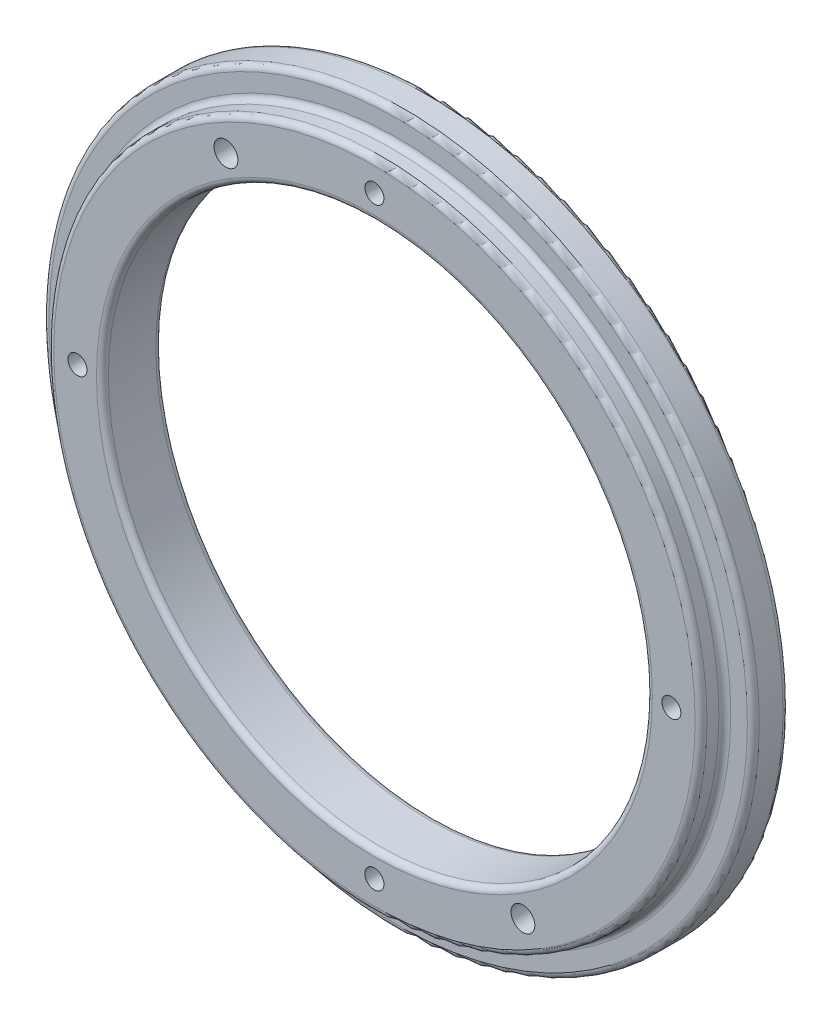
ISO-10303-21;
HEADER;
FILE_DESCRIPTION(('STEP AP214'),'2;1');
FILE_NAME('part.step','',(''),(''),'','','');
FILE_SCHEMA(('AUTOMOTIVE_DESIGN { 1 0 10303 214 1 1 1 1 }'));
ENDSEC;
DATA;
#1=APPLICATION_CONTEXT('core data for automotive mechanical design processes');
#2=APPLICATION_PROTOCOL_DEFINITION('international standard','automotive_design',2000,#1);
#3=PRODUCT_CONTEXT('',#1,'mechanical');
#4=PRODUCT('Part','Part','',(#3));
#5=PRODUCT_RELATED_PRODUCT_CATEGORY('part','',(#4));
#6=PRODUCT_DEFINITION_FORMATION('','',#4);
#7=PRODUCT_DEFINITION_CONTEXT('part definition',#1,'design');
#8=PRODUCT_DEFINITION('design','',#6,#7);
#9=PRODUCT_DEFINITION_SHAPE('','',#8);
#10=(LENGTH_UNIT() NAMED_UNIT(*) SI_UNIT(.MILLI.,.METRE.));
#11=(NAMED_UNIT(*) PLANE_ANGLE_UNIT() SI_UNIT($,.RADIAN.));
#12=(NAMED_UNIT(*) SI_UNIT($,.STERADIAN.) SOLID_ANGLE_UNIT());
#13=UNCERTAINTY_MEASURE_WITH_UNIT(LENGTH_MEASURE(1.E-05),#10,'distance_accuracy_value','');
#14=(GEOMETRIC_REPRESENTATION_CONTEXT(3) GLOBAL_UNCERTAINTY_ASSIGNED_CONTEXT((#13)) GLOBAL_UNIT_ASSIGNED_CONTEXT((#10,
#11,#12)) REPRESENTATION_CONTEXT('',''));
#15=CARTESIAN_POINT('',(0.,0.,0.));
#16=DIRECTION('',(0.,0.,1.));
#17=DIRECTION('',(1.,0.,0.));
#18=AXIS2_PLACEMENT_3D('',#15,#16,#17);
#19=CARTESIAN_POINT('',(0.,0.,7.62));
#20=DIRECTION('',(0.,0.,1.));
#21=DIRECTION('',(1.,0.,0.));
#22=AXIS2_PLACEMENT_3D('',#19,#20,#21);
#23=PLANE('',#22);
#24=CARTESIAN_POINT('',(0.,0.,7.62));
#25=DIRECTION('',(0.,0.,1.));
#26=DIRECTION('',(1.,0.,0.));
#27=AXIS2_PLACEMENT_3D('',#24,#25,#26);
#28=CIRCLE('',#27,71.12);
#29=CARTESIAN_POINT('',(71.12,0.,7.62));
#30=VERTEX_POINT('',#29);
#31=EDGE_CURVE('E54',#30,#30,#28,.F.);
#32=ORIENTED_EDGE('',*,*,#31,.T.);
#33=EDGE_LOOP('',(#32));
#34=FACE_BOUND('',#33,.T.);
#35=CARTESIAN_POINT('',(0.,0.,7.62));
#36=DIRECTION('',(0.,0.,1.));
#37=DIRECTION('',(1.,0.,0.));
#38=AXIS2_PLACEMENT_3D('',#35,#36,#37);
#39=CIRCLE('',#38,74.676);
#40=CARTESIAN_POINT('',(74.676,0.,7.62));
#41=VERTEX_POINT('',#40);
#42=EDGE_CURVE('E58',#41,#41,#39,.T.);
#43=ORIENTED_EDGE('',*,*,#42,.T.);
#44=EDGE_LOOP('',(#43));
#45=FACE_BOUND('',#44,.T.);
#46=ADVANCED_FACE('F43',(#34,#45),#23,.T.);
#47=CARTESIAN_POINT('',(0.,0.,0.));
#48=DIRECTION('',(0.,0.,1.));
#49=DIRECTION('',(1.,0.,0.));
#50=AXIS2_PLACEMENT_3D('',#47,#48,#49);
#51=PLANE('',#50);
#52=CARTESIAN_POINT('',(31.7500000000002,-54.9926131403117,0.));
#53=DIRECTION('',(0.,0.,-1.));
#54=DIRECTION('',(-1.,0.,0.));
#55=AXIS2_PLACEMENT_3D('',#52,#53,#54);
#56=CIRCLE('',#55,2.55270000000001);
#57=CARTESIAN_POINT('',(29.1973000000002,-54.9926131403117,0.));
#58=VERTEX_POINT('',#57);
#59=EDGE_CURVE('E118',#58,#58,#56,.T.);
#60=ORIENTED_EDGE('',*,*,#59,.F.);
#61=EDGE_LOOP('',(#60));
#62=FACE_BOUND('',#61,.T.);
#63=CARTESIAN_POINT('',(-31.7500000000003,54.9926131403117,0.));
#64=DIRECTION('',(0.,0.,-1.));
#65=DIRECTION('',(-1.,0.,0.));
#66=AXIS2_PLACEMENT_3D('',#63,#64,#65);
#67=CIRCLE('',#66,2.55270000000001);
#68=CARTESIAN_POINT('',(-34.3027000000003,54.9926131403117,0.));
#69=VERTEX_POINT('',#68);
#70=EDGE_CURVE('E115',#69,#69,#67,.T.);
#71=ORIENTED_EDGE('',*,*,#70,.F.);
#72=EDGE_LOOP('',(#71));
#73=FACE_BOUND('',#72,.T.);
#74=CARTESIAN_POINT('',(0.,0.,0.));
#75=DIRECTION('',(0.,0.,1.));
#76=DIRECTION('',(1.,0.,0.));
#77=AXIS2_PLACEMENT_3D('',#74,#75,#76);
#78=CIRCLE('',#77,59.436);
#79=CARTESIAN_POINT('',(59.436,0.,0.));
#80=VERTEX_POINT('',#79);
#81=EDGE_CURVE('E69',#80,#80,#78,.T.);
#82=ORIENTED_EDGE('',*,*,#81,.T.);
#83=EDGE_LOOP('',(#82));
#84=FACE_BOUND('',#83,.T.);
#85=CARTESIAN_POINT('',(0.,0.,0.));
#86=DIRECTION('',(0.,0.,1.));
#87=DIRECTION('',(1.,0.,0.));
#88=AXIS2_PLACEMENT_3D('',#85,#86,#87);
#89=CIRCLE('',#88,74.676);
#90=CARTESIAN_POINT('',(74.676,0.,0.));
#91=VERTEX_POINT('',#90);
#92=EDGE_CURVE('E72',#91,#91,#89,.F.);
#93=ORIENTED_EDGE('',*,*,#92,.T.);
#94=EDGE_LOOP('',(#93));
#95=FACE_BOUND('',#94,.T.);
#96=CARTESIAN_POINT('',(0.,63.5,0.));
#97=DIRECTION('',(0.,0.,-1.));
#98=DIRECTION('',(-1.,0.,0.));
#99=AXIS2_PLACEMENT_3D('',#96,#97,#98);
#100=CIRCLE('',#99,2.032);
#101=CARTESIAN_POINT('',(-2.032,63.5,0.));
#102=VERTEX_POINT('',#101);
#103=EDGE_CURVE('E107',#102,#102,#100,.T.);
#104=ORIENTED_EDGE('',*,*,#103,.F.);
#105=EDGE_LOOP('',(#104));
#106=FACE_BOUND('',#105,.T.);
#107=CARTESIAN_POINT('',(-63.5,0.,0.));
#108=DIRECTION('',(0.,0.,-1.));
#109=DIRECTION('',(-1.,0.,0.));
#110=AXIS2_PLACEMENT_3D('',#107,#108,#109);
#111=CIRCLE('',#110,2.03200000000001);
#112=CARTESIAN_POINT('',(-65.532,0.,0.));
#113=VERTEX_POINT('',#112);
#114=EDGE_CURVE('E104',#113,#113,#111,.T.);
#115=ORIENTED_EDGE('',*,*,#114,.F.);
#116=EDGE_LOOP('',(#115));
#117=FACE_BOUND('',#116,.T.);
#118=CARTESIAN_POINT('',(0.,-63.5,0.));
#119=DIRECTION('',(0.,0.,-1.));
#120=DIRECTION('',(-1.,0.,0.));
#121=AXIS2_PLACEMENT_3D('',#118,#119,#120);
#122=CIRCLE('',#121,2.03200000000001);
#123=CARTESIAN_POINT('',(-2.03200000000001,-63.5,0.));
#124=VERTEX_POINT('',#123);
#125=EDGE_CURVE('E98',#124,#124,#122,.T.);
#126=ORIENTED_EDGE('',*,*,#125,.F.);
#127=EDGE_LOOP('',(#126));
#128=FACE_BOUND('',#127,.T.);
#129=CARTESIAN_POINT('',(63.5,0.,0.));
#130=DIRECTION('',(0.,0.,-1.));
#131=DIRECTION('',(-1.,0.,0.));
#132=AXIS2_PLACEMENT_3D('',#129,#130,#131);
#133=CIRCLE('',#132,2.03200000000001);
#134=CARTESIAN_POINT('',(61.468,0.,0.));
#135=VERTEX_POINT('',#134);
#136=EDGE_CURVE('E91',#135,#135,#133,.T.);
#137=ORIENTED_EDGE('',*,*,#136,.F.);
#138=EDGE_LOOP('',(#137));
#139=FACE_BOUND('',#138,.T.);
#140=ADVANCED_FACE('F134',(#62,#73,#84,#95,#106,#117,#128,#139),#51,.F.);
#141=CARTESIAN_POINT('',(0.,0.,7.62));
#142=DIRECTION('',(0.,0.,-1.));
#143=DIRECTION('',(-1.,0.,0.));
#144=AXIS2_PLACEMENT_3D('',#141,#142,#143);
#145=CYLINDRICAL_SURFACE('',#144,75.946);
#146=CARTESIAN_POINT('',(0.,0.,6.35));
#147=DIRECTION('',(0.,0.,1.));
#148=DIRECTION('',(1.,0.,0.));
#149=AXIS2_PLACEMENT_3D('',#146,#147,#148);
#150=CIRCLE('',#149,75.946);
#151=CARTESIAN_POINT('',(-75.946,0.,6.35));
#152=VERTEX_POINT('',#151);
#153=EDGE_CURVE('E10',#152,#152,#150,.F.);
#154=CARTESIAN_POINT('',(0.,0.,1.27));
#155=DIRECTION('',(0.,0.,1.));
#156=DIRECTION('',(1.,0.,0.));
#157=AXIS2_PLACEMENT_3D('',#154,#155,#156);
#158=CIRCLE('',#157,75.946);
#159=CARTESIAN_POINT('',(-75.946,0.,1.27));
#160=VERTEX_POINT('',#159);
#161=EDGE_CURVE('E50',#160,#160,#158,.T.);
#162=CARTESIAN_POINT('',(-75.946,0.,6.35));
#163=CARTESIAN_POINT('',(-75.946,0.,6.29708333333333));
#164=CARTESIAN_POINT('',(-75.946,0.,6.24416666666666));
#165=CARTESIAN_POINT('',(-75.946,0.,6.13833333333333));
#166=CARTESIAN_POINT('',(-75.946,0.,6.08541666666667));
#167=CARTESIAN_POINT('',(-75.946,0.,5.97958333333333));
#168=CARTESIAN_POINT('',(-75.946,0.,5.92666666666666));
#169=CARTESIAN_POINT('',(-75.946,0.,5.82083333333333));
#170=CARTESIAN_POINT('',(-75.946,0.,5.76791666666667));
#171=CARTESIAN_POINT('',(-75.946,0.,5.66208333333333));
#172=CARTESIAN_POINT('',(-75.946,0.,5.60916666666667));
#173=CARTESIAN_POINT('',(-75.946,0.,5.50333333333333));
#174=CARTESIAN_POINT('',(-75.946,0.,5.45041666666667));
#175=CARTESIAN_POINT('',(-75.946,0.,5.34458333333333));
#176=CARTESIAN_POINT('',(-75.946,0.,5.29166666666667));
#177=CARTESIAN_POINT('',(-75.946,0.,5.18583333333333));
#178=CARTESIAN_POINT('',(-75.946,0.,5.13291666666667));
#179=CARTESIAN_POINT('',(-75.946,0.,5.02708333333333));
#180=CARTESIAN_POINT('',(-75.946,0.,4.97416666666667));
#181=CARTESIAN_POINT('',(-75.946,0.,4.86833333333333));
#182=CARTESIAN_POINT('',(-75.946,0.,4.81541666666667));
#183=CARTESIAN_POINT('',(-75.946,0.,4.70958333333333));
#184=CARTESIAN_POINT('',(-75.946,0.,4.65666666666667));
#185=CARTESIAN_POINT('',(-75.946,0.,4.55083333333333));
#186=CARTESIAN_POINT('',(-75.946,0.,4.49791666666667));
#187=CARTESIAN_POINT('',(-75.946,0.,4.39208333333333));
#188=CARTESIAN_POINT('',(-75.946,0.,4.33916666666667));
#189=CARTESIAN_POINT('',(-75.946,0.,4.23333333333333));
#190=CARTESIAN_POINT('',(-75.946,0.,4.18041666666667));
#191=CARTESIAN_POINT('',(-75.946,0.,4.07458333333333));
#192=CARTESIAN_POINT('',(-75.946,0.,4.02166666666667));
#193=CARTESIAN_POINT('',(-75.946,0.,3.91583333333333));
#194=CARTESIAN_POINT('',(-75.946,0.,3.86291666666667));
#195=CARTESIAN_POINT('',(-75.946,0.,3.75708333333333));
#196=CARTESIAN_POINT('',(-75.946,0.,3.70416666666667));
#197=CARTESIAN_POINT('',(-75.946,0.,3.59833333333333));
#198=CARTESIAN_POINT('',(-75.946,0.,3.54541666666667));
#199=CARTESIAN_POINT('',(-75.946,0.,3.43958333333333));
#200=CARTESIAN_POINT('',(-75.946,0.,3.38666666666667));
#201=CARTESIAN_POINT('',(-75.946,0.,3.28083333333333));
#202=CARTESIAN_POINT('',(-75.946,0.,3.22791666666667));
#203=CARTESIAN_POINT('',(-75.946,0.,3.12208333333333));
#204=CARTESIAN_POINT('',(-75.946,0.,3.06916666666667));
#205=CARTESIAN_POINT('',(-75.946,0.,2.96333333333333));
#206=CARTESIAN_POINT('',(-75.946,0.,2.91041666666667));
#207=CARTESIAN_POINT('',(-75.946,0.,2.80458333333333));
#208=CARTESIAN_POINT('',(-75.946,0.,2.75166666666667));
#209=CARTESIAN_POINT('',(-75.946,0.,2.64583333333333));
#210=CARTESIAN_POINT('',(-75.946,0.,2.59291666666667));
#211=CARTESIAN_POINT('',(-75.946,0.,2.48708333333333));
#212=CARTESIAN_POINT('',(-75.946,0.,2.43416666666667));
#213=CARTESIAN_POINT('',(-75.946,0.,2.32833333333333));
#214=CARTESIAN_POINT('',(-75.946,0.,2.27541666666667));
#215=CARTESIAN_POINT('',(-75.946,0.,2.16958333333333));
#216=CARTESIAN_POINT('',(-75.946,0.,2.11666666666667));
#217=CARTESIAN_POINT('',(-75.946,0.,2.01083333333333));
#218=CARTESIAN_POINT('',(-75.946,0.,1.95791666666667));
#219=CARTESIAN_POINT('',(-75.946,0.,1.85208333333333));
#220=CARTESIAN_POINT('',(-75.946,0.,1.79916666666667));
#221=CARTESIAN_POINT('',(-75.946,0.,1.69333333333333));
#222=CARTESIAN_POINT('',(-75.946,0.,1.64041666666667));
#223=CARTESIAN_POINT('',(-75.946,0.,1.53458333333333));
#224=CARTESIAN_POINT('',(-75.946,0.,1.48166666666667));
#225=CARTESIAN_POINT('',(-75.946,0.,1.37583333333333));
#226=CARTESIAN_POINT('',(-75.946,0.,1.32291666666667));
#227=CARTESIAN_POINT('',(-75.946,0.,1.27));
#228=B_SPLINE_CURVE_WITH_KNOTS('',3,(#162,#163,#164,#165,#166,#167,#168,#169,#170,#171,#172,
#173,#174,#175,#176,#177,#178,#179,#180,#181,#182,#183,#184,#185,#186,#187,#188,#189,#190,#191,
#192,#193,#194,#195,#196,#197,#198,#199,#200,#201,#202,#203,#204,#205,#206,#207,#208,#209,#210,
#211,#212,#213,#214,#215,#216,#217,#218,#219,#220,#221,#222,#223,#224,#225,#226,#227),
.UNSPECIFIED.,.F.,.F.,(4,2,2,2,2,2,2,2,2,2,2,2,2,2,2,2,2,2,2,2,2,2,2,2,2,2,2,2,2,2,2,2,4),(0.,
0.15875,0.3175,0.47625,0.635,0.79375,0.952499999999999,1.11125,1.27,1.42875,1.5875,1.74625,
1.905,2.06375,2.2225,2.38125,2.54,2.69875,2.8575,3.01625,3.175,3.33375,3.4925,3.65125,3.81,
3.96875,4.1275,4.28625,4.445,4.60375,4.7625,4.92125,5.08),.UNSPECIFIED.);
#229=EDGE_CURVE('BSEAM137',#152,#160,#228,.T.);
#230=ORIENTED_EDGE('',*,*,#153,.T.);
#231=ORIENTED_EDGE('',*,*,#161,.T.);
#232=ORIENTED_EDGE('',*,*,#229,.T.);
#233=ORIENTED_EDGE('',*,*,#229,.F.);
#234=EDGE_LOOP('',(#230,#232,#231,#233));
#235=FACE_BOUND('',#234,.T.);
#236=ADVANCED_FACE('F137',(#235),#145,.T.);
#237=CARTESIAN_POINT('',(0.,0.,7.62));
#238=DIRECTION('',(0.,0.,-1.));
#239=DIRECTION('',(-1.,0.,0.));
#240=AXIS2_PLACEMENT_3D('',#237,#238,#239);
#241=CYLINDRICAL_SURFACE('',#240,58.166);
#242=CARTESIAN_POINT('',(0.,0.,11.43));
#243=DIRECTION('',(0.,0.,1.));
#244=DIRECTION('',(1.,0.,0.));
#245=AXIS2_PLACEMENT_3D('',#242,#243,#244);
#246=CIRCLE('',#245,58.166);
#247=CARTESIAN_POINT('',(-58.166,0.,11.43));
#248=VERTEX_POINT('',#247);
#249=EDGE_CURVE('E81',#248,#248,#246,.T.);
#250=CARTESIAN_POINT('',(0.,0.,1.27));
#251=DIRECTION('',(0.,0.,1.));
#252=DIRECTION('',(1.,0.,0.));
#253=AXIS2_PLACEMENT_3D('',#250,#251,#252);
#254=CIRCLE('',#253,58.166);
#255=CARTESIAN_POINT('',(-58.166,0.,1.27));
#256=VERTEX_POINT('',#255);
#257=EDGE_CURVE('E84',#256,#256,#254,.F.);
#258=CARTESIAN_POINT('',(-58.166,0.,11.43));
#259=CARTESIAN_POINT('',(-58.166,0.,11.3241666666667));
#260=CARTESIAN_POINT('',(-58.166,0.,11.2183333333333));
#261=CARTESIAN_POINT('',(-58.166,0.,11.0066666666667));
#262=CARTESIAN_POINT('',(-58.166,0.,10.9008333333333));
#263=CARTESIAN_POINT('',(-58.166,0.,10.6891666666667));
#264=CARTESIAN_POINT('',(-58.166,0.,10.5833333333333));
#265=CARTESIAN_POINT('',(-58.166,0.,10.3716666666667));
#266=CARTESIAN_POINT('',(-58.166,0.,10.2658333333333));
#267=CARTESIAN_POINT('',(-58.166,0.,10.0541666666667));
#268=CARTESIAN_POINT('',(-58.166,0.,9.94833333333333));
#269=CARTESIAN_POINT('',(-58.166,0.,9.73666666666666));
#270=CARTESIAN_POINT('',(-58.166,0.,9.63083333333333));
#271=CARTESIAN_POINT('',(-58.166,0.,9.41916666666667));
#272=CARTESIAN_POINT('',(-58.166,0.,9.31333333333333));
#273=CARTESIAN_POINT('',(-58.166,0.,9.10166666666667));
#274=CARTESIAN_POINT('',(-58.166,0.,8.99583333333333));
#275=CARTESIAN_POINT('',(-58.166,0.,8.78416666666667));
#276=CARTESIAN_POINT('',(-58.166,0.,8.67833333333333));
#277=CARTESIAN_POINT('',(-58.166,0.,8.46666666666667));
#278=CARTESIAN_POINT('',(-58.166,0.,8.36083333333333));
#279=CARTESIAN_POINT('',(-58.166,0.,8.14916666666667));
#280=CARTESIAN_POINT('',(-58.166,0.,8.04333333333333));
#281=CARTESIAN_POINT('',(-58.166,0.,7.83166666666667));
#282=CARTESIAN_POINT('',(-58.166,0.,7.72583333333333));
#283=CARTESIAN_POINT('',(-58.166,0.,7.51416666666667));
#284=CARTESIAN_POINT('',(-58.166,0.,7.40833333333333));
#285=CARTESIAN_POINT('',(-58.166,0.,7.19666666666667));
#286=CARTESIAN_POINT('',(-58.166,0.,7.09083333333333));
#287=CARTESIAN_POINT('',(-58.166,0.,6.87916666666667));
#288=CARTESIAN_POINT('',(-58.166,0.,6.77333333333333));
#289=CARTESIAN_POINT('',(-58.166,0.,6.56166666666667));
#290=CARTESIAN_POINT('',(-58.166,0.,6.45583333333333));
#291=CARTESIAN_POINT('',(-58.166,0.,6.24416666666666));
#292=CARTESIAN_POINT('',(-58.166,0.,6.13833333333333));
#293=CARTESIAN_POINT('',(-58.166,0.,5.92666666666666));
#294=CARTESIAN_POINT('',(-58.166,0.,5.82083333333333));
#295=CARTESIAN_POINT('',(-58.166,0.,5.60916666666667));
#296=CARTESIAN_POINT('',(-58.166,0.,5.50333333333333));
#297=CARTESIAN_POINT('',(-58.166,0.,5.29166666666667));
#298=CARTESIAN_POINT('',(-58.166,0.,5.18583333333333));
#299=CARTESIAN_POINT('',(-58.166,0.,4.97416666666667));
#300=CARTESIAN_POINT('',(-58.166,0.,4.86833333333333));
#301=CARTESIAN_POINT('',(-58.166,0.,4.65666666666667));
#302=CARTESIAN_POINT('',(-58.166,0.,4.55083333333333));
#303=CARTESIAN_POINT('',(-58.166,0.,4.33916666666667));
#304=CARTESIAN_POINT('',(-58.166,0.,4.23333333333333));
#305=CARTESIAN_POINT('',(-58.166,0.,4.02166666666667));
#306=CARTESIAN_POINT('',(-58.166,0.,3.91583333333333));
#307=CARTESIAN_POINT('',(-58.166,0.,3.70416666666667));
#308=CARTESIAN_POINT('',(-58.166,0.,3.59833333333333));
#309=CARTESIAN_POINT('',(-58.166,0.,3.38666666666667));
#310=CARTESIAN_POINT('',(-58.166,0.,3.28083333333333));
#311=CARTESIAN_POINT('',(-58.166,0.,3.06916666666667));
#312=CARTESIAN_POINT('',(-58.166,0.,2.96333333333333));
#313=CARTESIAN_POINT('',(-58.166,0.,2.75166666666667));
#314=CARTESIAN_POINT('',(-58.166,0.,2.64583333333333));
#315=CARTESIAN_POINT('',(-58.166,0.,2.43416666666667));
#316=CARTESIAN_POINT('',(-58.166,0.,2.32833333333333));
#317=CARTESIAN_POINT('',(-58.166,0.,2.11666666666667));
#318=CARTESIAN_POINT('',(-58.166,0.,2.01083333333333));
#319=CARTESIAN_POINT('',(-58.166,0.,1.79916666666667));
#320=CARTESIAN_POINT('',(-58.166,0.,1.69333333333333));
#321=CARTESIAN_POINT('',(-58.166,0.,1.48166666666667));
#322=CARTESIAN_POINT('',(-58.166,0.,1.37583333333333));
#323=CARTESIAN_POINT('',(-58.166,0.,1.27));
#324=B_SPLINE_CURVE_WITH_KNOTS('',3,(#258,#259,#260,#261,#262,#263,#264,#265,#266,#267,#268,
#269,#270,#271,#272,#273,#274,#275,#276,#277,#278,#279,#280,#281,#282,#283,#284,#285,#286,#287,
#288,#289,#290,#291,#292,#293,#294,#295,#296,#297,#298,#299,#300,#301,#302,#303,#304,#305,#306,
#307,#308,#309,#310,#311,#312,#313,#314,#315,#316,#317,#318,#319,#320,#321,#322,#323),
.UNSPECIFIED.,.F.,.F.,(4,2,2,2,2,2,2,2,2,2,2,2,2,2,2,2,2,2,2,2,2,2,2,2,2,2,2,2,2,2,2,2,4),(0.,
0.3175,0.635,0.9525,1.27,1.5875,1.905,2.2225,2.54,2.8575,3.175,3.4925,3.81,4.1275,4.445,4.7625,
5.08,5.3975,5.715,6.0325,6.35,6.6675,6.985,7.3025,7.62,7.9375,8.255,8.5725,8.89,9.2075,9.525,
9.8425,10.16),.UNSPECIFIED.);
#325=EDGE_CURVE('BSEAM179',#248,#256,#324,.T.);
#326=ORIENTED_EDGE('',*,*,#249,.T.);
#327=ORIENTED_EDGE('',*,*,#257,.T.);
#328=ORIENTED_EDGE('',*,*,#325,.T.);
#329=ORIENTED_EDGE('',*,*,#325,.F.);
#330=EDGE_LOOP('',(#326,#328,#327,#329));
#331=FACE_BOUND('',#330,.T.);
#332=ADVANCED_FACE('F179',(#331),#241,.F.);
#333=CARTESIAN_POINT('',(0.,0.,12.7));
#334=DIRECTION('',(0.,0.,1.));
#335=DIRECTION('',(1.,0.,0.));
#336=AXIS2_PLACEMENT_3D('',#333,#334,#335);
#337=PLANE('',#336);
#338=CARTESIAN_POINT('',(31.7500000000002,-54.9926131403117,12.7));
#339=DIRECTION('',(0.,0.,-1.));
#340=DIRECTION('',(-1.,0.,0.));
#341=AXIS2_PLACEMENT_3D('',#338,#339,#340);
#342=CIRCLE('',#341,2.55270000000001);
#343=CARTESIAN_POINT('',(29.1973000000002,-54.9926131403117,12.7));
#344=VERTEX_POINT('',#343);
#345=EDGE_CURVE('E92',#344,#344,#342,.T.);
#346=ORIENTED_EDGE('',*,*,#345,.T.);
#347=EDGE_LOOP('',(#346));
#348=FACE_BOUND('',#347,.T.);
#349=CARTESIAN_POINT('',(-31.7500000000003,54.9926131403117,12.7));
#350=DIRECTION('',(0.,0.,-1.));
#351=DIRECTION('',(-1.,0.,0.));
#352=AXIS2_PLACEMENT_3D('',#349,#350,#351);
#353=CIRCLE('',#352,2.55270000000001);
#354=CARTESIAN_POINT('',(-34.3027000000003,54.9926131403117,12.7));
#355=VERTEX_POINT('',#354);
#356=EDGE_CURVE('E112',#355,#355,#353,.T.);
#357=ORIENTED_EDGE('',*,*,#356,.T.);
#358=EDGE_LOOP('',(#357));
#359=FACE_BOUND('',#358,.T.);
#360=CARTESIAN_POINT('',(0.,0.,12.7));
#361=DIRECTION('',(0.,0.,1.));
#362=DIRECTION('',(1.,0.,0.));
#363=AXIS2_PLACEMENT_3D('',#360,#361,#362);
#364=CIRCLE('',#363,59.436);
#365=CARTESIAN_POINT('',(59.436,0.,12.7));
#366=VERTEX_POINT('',#365);
#367=EDGE_CURVE('E75',#366,#366,#364,.F.);
#368=ORIENTED_EDGE('',*,*,#367,.T.);
#369=EDGE_LOOP('',(#368));
#370=FACE_BOUND('',#369,.T.);
#371=CARTESIAN_POINT('',(0.,0.,12.7));
#372=DIRECTION('',(0.,0.,1.));
#373=DIRECTION('',(1.,0.,0.));
#374=AXIS2_PLACEMENT_3D('',#371,#372,#373);
#375=CIRCLE('',#374,68.58);
#376=CARTESIAN_POINT('',(68.58,0.,12.7));
#377=VERTEX_POINT('',#376);
#378=EDGE_CURVE('E78',#377,#377,#375,.T.);
#379=ORIENTED_EDGE('',*,*,#378,.T.);
#380=EDGE_LOOP('',(#379));
#381=FACE_BOUND('',#380,.T.);
#382=CARTESIAN_POINT('',(0.,63.5,12.7));
#383=DIRECTION('',(0.,0.,-1.));
#384=DIRECTION('',(-1.,0.,0.));
#385=AXIS2_PLACEMENT_3D('',#382,#383,#384);
#386=CIRCLE('',#385,2.032);
#387=CARTESIAN_POINT('',(-2.032,63.5,12.7));
#388=VERTEX_POINT('',#387);
#389=EDGE_CURVE('E87',#388,#388,#386,.T.);
#390=ORIENTED_EDGE('',*,*,#389,.T.);
#391=EDGE_LOOP('',(#390));
#392=FACE_BOUND('',#391,.T.);
#393=CARTESIAN_POINT('',(-63.5,0.,12.7));
#394=DIRECTION('',(0.,0.,-1.));
#395=DIRECTION('',(-1.,0.,0.));
#396=AXIS2_PLACEMENT_3D('',#393,#394,#395);
#397=CIRCLE('',#396,2.03200000000001);
#398=CARTESIAN_POINT('',(-65.532,0.,12.7));
#399=VERTEX_POINT('',#398);
#400=EDGE_CURVE('E101',#399,#399,#397,.T.);
#401=ORIENTED_EDGE('',*,*,#400,.T.);
#402=EDGE_LOOP('',(#401));
#403=FACE_BOUND('',#402,.T.);
#404=CARTESIAN_POINT('',(0.,-63.5,12.7));
#405=DIRECTION('',(0.,0.,-1.));
#406=DIRECTION('',(-1.,0.,0.));
#407=AXIS2_PLACEMENT_3D('',#404,#405,#406);
#408=CIRCLE('',#407,2.03200000000001);
#409=CARTESIAN_POINT('',(-2.03200000000001,-63.5,12.7));
#410=VERTEX_POINT('',#409);
#411=EDGE_CURVE('E95',#410,#410,#408,.T.);
#412=ORIENTED_EDGE('',*,*,#411,.T.);
#413=EDGE_LOOP('',(#412));
#414=FACE_BOUND('',#413,.T.);
#415=CARTESIAN_POINT('',(63.5,0.,12.7));
#416=DIRECTION('',(0.,0.,-1.));
#417=DIRECTION('',(-1.,0.,0.));
#418=AXIS2_PLACEMENT_3D('',#415,#416,#417);
#419=CIRCLE('',#418,2.03200000000001);
#420=CARTESIAN_POINT('',(61.468,0.,12.7));
#421=VERTEX_POINT('',#420);
#422=EDGE_CURVE('E88',#421,#421,#419,.T.);
#423=ORIENTED_EDGE('',*,*,#422,.T.);
#424=EDGE_LOOP('',(#423));
#425=FACE_BOUND('',#424,.T.);
#426=ADVANCED_FACE('F124',(#348,#359,#370,#381,#392,#403,#414,#425),#337,.T.);
#427=CARTESIAN_POINT('',(0.,0.,12.7));
#428=DIRECTION('',(0.,0.,-1.));
#429=DIRECTION('',(-1.,0.,0.));
#430=AXIS2_PLACEMENT_3D('',#427,#428,#429);
#431=CYLINDRICAL_SURFACE('',#430,69.85);
#432=CARTESIAN_POINT('',(0.,0.,8.89));
#433=DIRECTION('',(0.,0.,1.));
#434=DIRECTION('',(1.,0.,0.));
#435=AXIS2_PLACEMENT_3D('',#432,#433,#434);
#436=CIRCLE('',#435,69.85);
#437=CARTESIAN_POINT('',(69.85,0.,8.89));
#438=VERTEX_POINT('',#437);
#439=EDGE_CURVE('E63',#438,#438,#436,.T.);
#440=ORIENTED_EDGE('',*,*,#439,.T.);
#441=EDGE_LOOP('',(#440));
#442=FACE_BOUND('',#441,.T.);
#443=CARTESIAN_POINT('',(0.,0.,11.43));
#444=DIRECTION('',(0.,0.,1.));
#445=DIRECTION('',(1.,0.,0.));
#446=AXIS2_PLACEMENT_3D('',#443,#444,#445);
#447=CIRCLE('',#446,69.85);
#448=CARTESIAN_POINT('',(69.85,0.,11.43));
#449=VERTEX_POINT('',#448);
#450=EDGE_CURVE('E66',#449,#449,#447,.F.);
#451=ORIENTED_EDGE('',*,*,#450,.T.);
#452=EDGE_LOOP('',(#451));
#453=FACE_BOUND('',#452,.T.);
#454=ADVANCED_FACE('F156',(#442,#453),#431,.T.);
#455=CARTESIAN_POINT('',(63.5,0.,12.7));
#456=DIRECTION('',(0.,0.,-1.));
#457=DIRECTION('',(-1.,0.,0.));
#458=AXIS2_PLACEMENT_3D('',#455,#456,#457);
#459=CYLINDRICAL_SURFACE('',#458,2.03200000000001);
#460=ORIENTED_EDGE('',*,*,#422,.F.);
#461=EDGE_LOOP('',(#460));
#462=FACE_BOUND('',#461,.T.);
#463=ORIENTED_EDGE('',*,*,#136,.T.);
#464=EDGE_LOOP('',(#463));
#465=FACE_BOUND('',#464,.T.);
#466=ADVANCED_FACE('F153',(#462,#465),#459,.F.);
#467=CARTESIAN_POINT('',(0.,-63.5,12.7));
#468=DIRECTION('',(0.,0.,-1.));
#469=DIRECTION('',(-1.,0.,0.));
#470=AXIS2_PLACEMENT_3D('',#467,#468,#469);
#471=CYLINDRICAL_SURFACE('',#470,2.03200000000001);
#472=ORIENTED_EDGE('',*,*,#411,.F.);
#473=EDGE_LOOP('',(#472));
#474=FACE_BOUND('',#473,.T.);
#475=ORIENTED_EDGE('',*,*,#125,.T.);
#476=EDGE_LOOP('',(#475));
#477=FACE_BOUND('',#476,.T.);
#478=ADVANCED_FACE('F155',(#474,#477),#471,.F.);
#479=CARTESIAN_POINT('',(-63.5,0.,12.7));
#480=DIRECTION('',(0.,0.,-1.));
#481=DIRECTION('',(-1.,0.,0.));
#482=AXIS2_PLACEMENT_3D('',#479,#480,#481);
#483=CYLINDRICAL_SURFACE('',#482,2.03200000000001);
#484=ORIENTED_EDGE('',*,*,#400,.F.);
#485=EDGE_LOOP('',(#484));
#486=FACE_BOUND('',#485,.T.);
#487=ORIENTED_EDGE('',*,*,#114,.T.);
#488=EDGE_LOOP('',(#487));
#489=FACE_BOUND('',#488,.T.);
#490=ADVANCED_FACE('F162',(#486,#489),#483,.F.);
#491=CARTESIAN_POINT('',(0.,63.5,12.7));
#492=DIRECTION('',(0.,0.,-1.));
#493=DIRECTION('',(-1.,0.,0.));
#494=AXIS2_PLACEMENT_3D('',#491,#492,#493);
#495=CYLINDRICAL_SURFACE('',#494,2.032);
#496=ORIENTED_EDGE('',*,*,#389,.F.);
#497=EDGE_LOOP('',(#496));
#498=FACE_BOUND('',#497,.T.);
#499=ORIENTED_EDGE('',*,*,#103,.T.);
#500=EDGE_LOOP('',(#499));
#501=FACE_BOUND('',#500,.T.);
#502=ADVANCED_FACE('F186',(#498,#501),#495,.F.);
#503=CARTESIAN_POINT('',(0.,0.,11.43));
#504=DIRECTION('',(0.,0.,1.));
#505=DIRECTION('',(1.,0.,0.));
#506=AXIS2_PLACEMENT_3D('',#503,#504,#505);
#507=TOROIDAL_SURFACE('',#506,59.436,1.27);
#508=ORIENTED_EDGE('',*,*,#367,.F.);
#509=EDGE_LOOP('',(#508));
#510=FACE_BOUND('',#509,.T.);
#511=ORIENTED_EDGE('',*,*,#249,.F.);
#512=EDGE_LOOP('',(#511));
#513=FACE_BOUND('',#512,.T.);
#514=ADVANCED_FACE('F182',(#510,#513),#507,.T.);
#515=CARTESIAN_POINT('',(0.,0.,1.27));
#516=DIRECTION('',(0.,0.,1.));
#517=DIRECTION('',(1.,0.,0.));
#518=AXIS2_PLACEMENT_3D('',#515,#516,#517);
#519=TOROIDAL_SURFACE('',#518,59.436,1.27);
#520=ORIENTED_EDGE('',*,*,#257,.F.);
#521=EDGE_LOOP('',(#520));
#522=FACE_BOUND('',#521,.T.);
#523=ORIENTED_EDGE('',*,*,#81,.F.);
#524=EDGE_LOOP('',(#523));
#525=FACE_BOUND('',#524,.T.);
#526=ADVANCED_FACE('F185',(#522,#525),#519,.T.);
#527=CARTESIAN_POINT('',(0.,0.,8.89));
#528=DIRECTION('',(0.,0.,1.));
#529=DIRECTION('',(1.,0.,0.));
#530=AXIS2_PLACEMENT_3D('',#527,#528,#529);
#531=TOROIDAL_SURFACE('',#530,71.12,1.27);
#532=ORIENTED_EDGE('',*,*,#31,.F.);
#533=EDGE_LOOP('',(#532));
#534=FACE_BOUND('',#533,.T.);
#535=ORIENTED_EDGE('',*,*,#439,.F.);
#536=EDGE_LOOP('',(#535));
#537=FACE_BOUND('',#536,.T.);
#538=ADVANCED_FACE('F190',(#534,#537),#531,.F.);
#539=CARTESIAN_POINT('',(0.,0.,11.43));
#540=DIRECTION('',(0.,0.,1.));
#541=DIRECTION('',(1.,0.,0.));
#542=AXIS2_PLACEMENT_3D('',#539,#540,#541);
#543=TOROIDAL_SURFACE('',#542,68.58,1.27);
#544=ORIENTED_EDGE('',*,*,#450,.F.);
#545=EDGE_LOOP('',(#544));
#546=FACE_BOUND('',#545,.T.);
#547=ORIENTED_EDGE('',*,*,#378,.F.);
#548=EDGE_LOOP('',(#547));
#549=FACE_BOUND('',#548,.T.);
#550=ADVANCED_FACE('F194',(#546,#549),#543,.T.);
#551=CARTESIAN_POINT('',(0.,0.,6.35));
#552=DIRECTION('',(0.,0.,1.));
#553=DIRECTION('',(1.,0.,0.));
#554=AXIS2_PLACEMENT_3D('',#551,#552,#553);
#555=TOROIDAL_SURFACE('',#554,74.676,1.27);
#556=ORIENTED_EDGE('',*,*,#153,.F.);
#557=EDGE_LOOP('',(#556));
#558=FACE_BOUND('',#557,.T.);
#559=ORIENTED_EDGE('',*,*,#42,.F.);
#560=EDGE_LOOP('',(#559));
#561=FACE_BOUND('',#560,.T.);
#562=ADVANCED_FACE('F197',(#558,#561),#555,.T.);
#563=CARTESIAN_POINT('',(0.,0.,1.27));
#564=DIRECTION('',(0.,0.,1.));
#565=DIRECTION('',(1.,0.,0.));
#566=AXIS2_PLACEMENT_3D('',#563,#564,#565);
#567=TOROIDAL_SURFACE('',#566,74.676,1.27);
#568=ORIENTED_EDGE('',*,*,#92,.F.);
#569=EDGE_LOOP('',(#568));
#570=FACE_BOUND('',#569,.T.);
#571=ORIENTED_EDGE('',*,*,#161,.F.);
#572=EDGE_LOOP('',(#571));
#573=FACE_BOUND('',#572,.T.);
#574=ADVANCED_FACE('F45',(#570,#573),#567,.T.);
#575=CARTESIAN_POINT('',(-31.7500000000003,54.9926131403117,12.7));
#576=DIRECTION('',(0.,0.,-1.));
#577=DIRECTION('',(-1.,0.,0.));
#578=AXIS2_PLACEMENT_3D('',#575,#576,#577);
#579=CYLINDRICAL_SURFACE('',#578,2.55270000000001);
#580=ORIENTED_EDGE('',*,*,#356,.F.);
#581=EDGE_LOOP('',(#580));
#582=FACE_BOUND('',#581,.T.);
#583=ORIENTED_EDGE('',*,*,#70,.T.);
#584=EDGE_LOOP('',(#583));
#585=FACE_BOUND('',#584,.T.);
#586=ADVANCED_FACE('F130',(#582,#585),#579,.F.);
#587=CARTESIAN_POINT('',(31.7500000000002,-54.9926131403117,12.7));
#588=DIRECTION('',(0.,0.,-1.));
#589=DIRECTION('',(-1.,0.,0.));
#590=AXIS2_PLACEMENT_3D('',#587,#588,#589);
#591=CYLINDRICAL_SURFACE('',#590,2.55270000000001);
#592=ORIENTED_EDGE('',*,*,#345,.F.);
#593=EDGE_LOOP('',(#592));
#594=FACE_BOUND('',#593,.T.);
#595=ORIENTED_EDGE('',*,*,#59,.T.);
#596=EDGE_LOOP('',(#595));
#597=FACE_BOUND('',#596,.T.);
#598=ADVANCED_FACE('F127',(#594,#597),#591,.F.);
#599=CLOSED_SHELL('',(#46,#140,#236,#332,#426,#454,#466,#478,#490,#502,#514,#526,#538,#550,#562,
#574,#586,#598));
#600=MANIFOLD_SOLID_BREP('B2',#599);
#601=ADVANCED_BREP_SHAPE_REPRESENTATION('',(#18,#600),#14);
#602=SHAPE_DEFINITION_REPRESENTATION(#9,#601);
ENDSEC;
END-ISO-10303-21;
